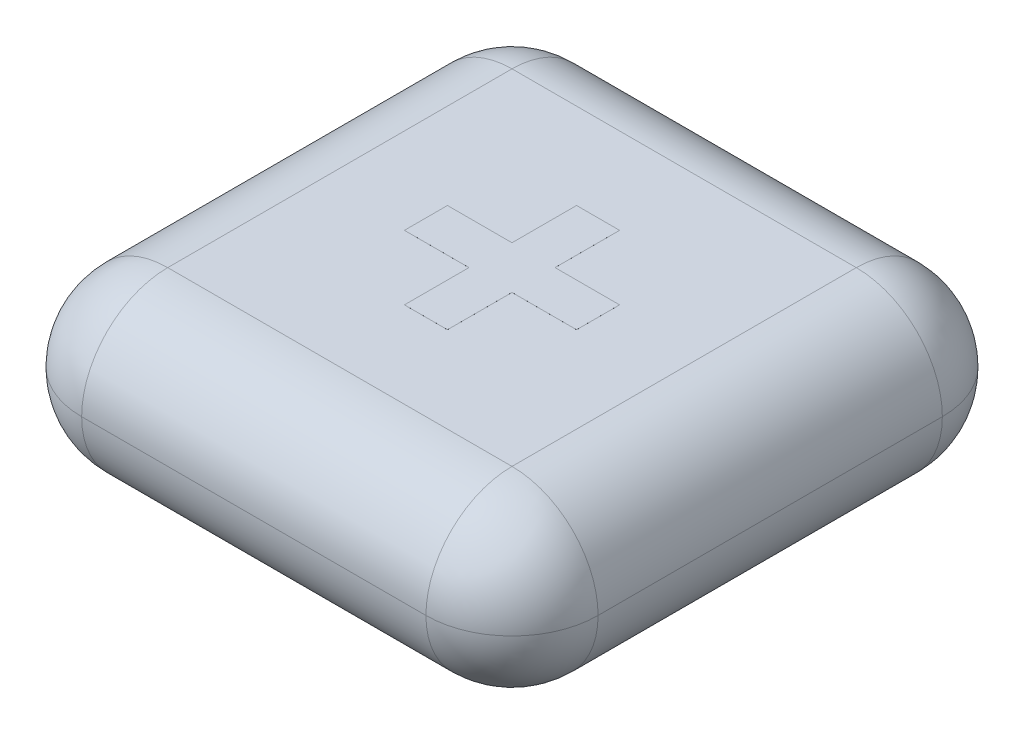
ISO-10303-21;
HEADER;
FILE_DESCRIPTION(('STEP AP214'),'2;1');
FILE_NAME('part.step','',(''),(''),'','','');
FILE_SCHEMA(('AUTOMOTIVE_DESIGN { 1 0 10303 214 1 1 1 1 }'));
ENDSEC;
DATA;
#1=APPLICATION_CONTEXT('core data for automotive mechanical design processes');
#2=APPLICATION_PROTOCOL_DEFINITION('international standard','automotive_design',2000,#1);
#3=PRODUCT_CONTEXT('',#1,'mechanical');
#4=PRODUCT('Part','Part','',(#3));
#5=PRODUCT_RELATED_PRODUCT_CATEGORY('part','',(#4));
#6=PRODUCT_DEFINITION_FORMATION('','',#4);
#7=PRODUCT_DEFINITION_CONTEXT('part definition',#1,'design');
#8=PRODUCT_DEFINITION('design','',#6,#7);
#9=PRODUCT_DEFINITION_SHAPE('','',#8);
#10=(LENGTH_UNIT() NAMED_UNIT(*) SI_UNIT(.MILLI.,.METRE.));
#11=(NAMED_UNIT(*) PLANE_ANGLE_UNIT() SI_UNIT($,.RADIAN.));
#12=(NAMED_UNIT(*) SI_UNIT($,.STERADIAN.) SOLID_ANGLE_UNIT());
#13=UNCERTAINTY_MEASURE_WITH_UNIT(LENGTH_MEASURE(1.E-05),#10,'distance_accuracy_value','');
#14=(GEOMETRIC_REPRESENTATION_CONTEXT(3) GLOBAL_UNCERTAINTY_ASSIGNED_CONTEXT((#13)) GLOBAL_UNIT_ASSIGNED_CONTEXT((#10,
#11,#12)) REPRESENTATION_CONTEXT('',''));
#15=CARTESIAN_POINT('',(0.,0.,0.));
#16=DIRECTION('',(0.,0.,1.));
#17=DIRECTION('',(1.,0.,0.));
#18=AXIS2_PLACEMENT_3D('',#15,#16,#17);
#19=CARTESIAN_POINT('',(0.,25.4,0.));
#20=DIRECTION('',(0.,1.,0.));
#21=DIRECTION('',(0.,0.,1.));
#22=AXIS2_PLACEMENT_3D('',#19,#20,#21);
#23=PLANE('',#22);
#24=DIRECTION('',(0.,0.,-1.));
#25=VECTOR('',#24,1.);
#26=CARTESIAN_POINT('',(-3.175,25.4,12.7));
#27=LINE('',#26,#25);
#28=CARTESIAN_POINT('',(-3.175,25.4,-3.175));
#29=VERTEX_POINT('',#28);
#30=CARTESIAN_POINT('',(-3.175,25.4,-12.7));
#31=VERTEX_POINT('',#30);
#32=EDGE_CURVE('E683',#29,#31,#27,.T.);
#33=ORIENTED_EDGE('',*,*,#32,.T.);
#34=DIRECTION('',(1.,0.,0.));
#35=VECTOR('',#34,1.);
#36=CARTESIAN_POINT('',(-3.175,25.4,-12.7));
#37=LINE('',#36,#35);
#38=CARTESIAN_POINT('',(3.175,25.4,-12.7));
#39=VERTEX_POINT('',#38);
#40=EDGE_CURVE('E679',#31,#39,#37,.T.);
#41=ORIENTED_EDGE('',*,*,#40,.T.);
#42=DIRECTION('',(0.,0.,-1.));
#43=VECTOR('',#42,1.);
#44=CARTESIAN_POINT('',(3.175,25.4,12.7));
#45=LINE('',#44,#43);
#46=CARTESIAN_POINT('',(3.175,25.4,-3.175));
#47=VERTEX_POINT('',#46);
#48=EDGE_CURVE('E676',#47,#39,#45,.T.);
#49=ORIENTED_EDGE('',*,*,#48,.F.);
#50=DIRECTION('',(1.,0.,0.));
#51=VECTOR('',#50,1.);
#52=CARTESIAN_POINT('',(0.,25.4,-3.175));
#53=LINE('',#52,#51);
#54=CARTESIAN_POINT('',(12.7,25.4,-3.175));
#55=VERTEX_POINT('',#54);
#56=EDGE_CURVE('E595',#47,#55,#53,.T.);
#57=ORIENTED_EDGE('',*,*,#56,.T.);
#58=DIRECTION('',(0.,0.,-1.));
#59=VECTOR('',#58,1.);
#60=CARTESIAN_POINT('',(12.7,25.4,0.));
#61=LINE('',#60,#59);
#62=CARTESIAN_POINT('',(12.7,25.4,3.175));
#63=VERTEX_POINT('',#62);
#64=EDGE_CURVE('E601',#63,#55,#61,.T.);
#65=ORIENTED_EDGE('',*,*,#64,.F.);
#66=DIRECTION('',(1.,0.,0.));
#67=VECTOR('',#66,1.);
#68=CARTESIAN_POINT('',(0.,25.4,3.175));
#69=LINE('',#68,#67);
#70=CARTESIAN_POINT('',(3.175,25.4,3.175));
#71=VERTEX_POINT('',#70);
#72=EDGE_CURVE('E607',#71,#63,#69,.T.);
#73=ORIENTED_EDGE('',*,*,#72,.F.);
#74=CARTESIAN_POINT('',(3.175,25.4,12.7));
#75=VERTEX_POINT('',#74);
#76=EDGE_CURVE('E570',#75,#71,#45,.T.);
#77=ORIENTED_EDGE('',*,*,#76,.F.);
#78=DIRECTION('',(1.,0.,0.));
#79=VECTOR('',#78,1.);
#80=CARTESIAN_POINT('',(-3.175,25.4,12.7));
#81=LINE('',#80,#79);
#82=CARTESIAN_POINT('',(-3.175,25.4,12.7));
#83=VERTEX_POINT('',#82);
#84=EDGE_CURVE('E95',#83,#75,#81,.T.);
#85=ORIENTED_EDGE('',*,*,#84,.F.);
#86=CARTESIAN_POINT('',(-3.175,25.4,3.175));
#87=VERTEX_POINT('',#86);
#88=EDGE_CURVE('E663',#83,#87,#27,.T.);
#89=ORIENTED_EDGE('',*,*,#88,.T.);
#90=DIRECTION('',(1.,0.,0.));
#91=VECTOR('',#90,1.);
#92=CARTESIAN_POINT('',(0.,25.4,3.175));
#93=LINE('',#92,#91);
#94=CARTESIAN_POINT('',(-12.7,25.4,3.175));
#95=VERTEX_POINT('',#94);
#96=EDGE_CURVE('E628',#95,#87,#93,.T.);
#97=ORIENTED_EDGE('',*,*,#96,.F.);
#98=DIRECTION('',(0.,0.,-1.));
#99=VECTOR('',#98,1.);
#100=CARTESIAN_POINT('',(-12.7,25.4,0.));
#101=LINE('',#100,#99);
#102=CARTESIAN_POINT('',(-12.7,25.4,-3.175));
#103=VERTEX_POINT('',#102);
#104=EDGE_CURVE('E641',#95,#103,#101,.T.);
#105=ORIENTED_EDGE('',*,*,#104,.T.);
#106=DIRECTION('',(1.,0.,0.));
#107=VECTOR('',#106,1.);
#108=CARTESIAN_POINT('',(0.,25.4,-3.175));
#109=LINE('',#108,#107);
#110=EDGE_CURVE('E637',#103,#29,#109,.T.);
#111=ORIENTED_EDGE('',*,*,#110,.T.);
#112=EDGE_LOOP('',(#33,#41,#49,#57,#65,#73,#77,#85,#89,#97,#105,#111));
#113=FACE_BOUND('',#112,.T.);
#114=DIRECTION('',(1.,0.,0.));
#115=VECTOR('',#114,1.);
#116=CARTESIAN_POINT('',(38.1,25.4,25.4));
#117=LINE('',#116,#115);
#118=CARTESIAN_POINT('',(-25.4,25.4,25.4));
#119=VERTEX_POINT('',#118);
#120=CARTESIAN_POINT('',(25.4,25.4,25.4));
#121=VERTEX_POINT('',#120);
#122=EDGE_CURVE('E87',#119,#121,#117,.T.);
#123=ORIENTED_EDGE('',*,*,#122,.T.);
#124=DIRECTION('',(0.,0.,-1.));
#125=VECTOR('',#124,1.);
#126=CARTESIAN_POINT('',(25.4,25.4,-38.1));
#127=LINE('',#126,#125);
#128=CARTESIAN_POINT('',(25.4,25.4,-25.4));
#129=VERTEX_POINT('',#128);
#130=EDGE_CURVE('E12',#121,#129,#127,.T.);
#131=ORIENTED_EDGE('',*,*,#130,.T.);
#132=DIRECTION('',(1.,0.,0.));
#133=VECTOR('',#132,1.);
#134=CARTESIAN_POINT('',(0.,25.4,-25.4));
#135=LINE('',#134,#133);
#136=CARTESIAN_POINT('',(-25.4,25.4,-25.4));
#137=VERTEX_POINT('',#136);
#138=EDGE_CURVE('E160',#129,#137,#135,.F.);
#139=ORIENTED_EDGE('',*,*,#138,.T.);
#140=DIRECTION('',(0.,0.,-1.));
#141=VECTOR('',#140,1.);
#142=CARTESIAN_POINT('',(-25.4,25.4,0.));
#143=LINE('',#142,#141);
#144=EDGE_CURVE('E162',#137,#119,#143,.F.);
#145=ORIENTED_EDGE('',*,*,#144,.T.);
#146=EDGE_LOOP('',(#123,#131,#139,#145));
#147=FACE_BOUND('',#146,.T.);
#148=ADVANCED_FACE('F77',(#113,#147),#23,.T.);
#149=CARTESIAN_POINT('',(0.,0.,0.));
#150=DIRECTION('',(0.,1.,0.));
#151=DIRECTION('',(0.,0.,1.));
#152=AXIS2_PLACEMENT_3D('',#149,#150,#151);
#153=PLANE('',#152);
#154=DIRECTION('',(1.,0.,0.));
#155=VECTOR('',#154,1.);
#156=CARTESIAN_POINT('',(0.,0.,25.4));
#157=LINE('',#156,#155);
#158=CARTESIAN_POINT('',(25.4,0.,25.4));
#159=VERTEX_POINT('',#158);
#160=CARTESIAN_POINT('',(-25.4,0.,25.4));
#161=VERTEX_POINT('',#160);
#162=EDGE_CURVE('E249',#159,#161,#157,.F.);
#163=ORIENTED_EDGE('',*,*,#162,.T.);
#164=DIRECTION('',(0.,0.,-1.));
#165=VECTOR('',#164,1.);
#166=CARTESIAN_POINT('',(-25.4,0.,-38.1));
#167=LINE('',#166,#165);
#168=CARTESIAN_POINT('',(-25.4,0.,-25.4));
#169=VERTEX_POINT('',#168);
#170=EDGE_CURVE('E169',#161,#169,#167,.T.);
#171=ORIENTED_EDGE('',*,*,#170,.T.);
#172=DIRECTION('',(1.,0.,0.));
#173=VECTOR('',#172,1.);
#174=CARTESIAN_POINT('',(38.1,0.,-25.4));
#175=LINE('',#174,#173);
#176=CARTESIAN_POINT('',(25.4,0.,-25.4));
#177=VERTEX_POINT('',#176);
#178=EDGE_CURVE('E143',#169,#177,#175,.T.);
#179=ORIENTED_EDGE('',*,*,#178,.T.);
#180=DIRECTION('',(0.,0.,-1.));
#181=VECTOR('',#180,1.);
#182=CARTESIAN_POINT('',(25.4,0.,0.));
#183=LINE('',#182,#181);
#184=EDGE_CURVE('E243',#177,#159,#183,.F.);
#185=ORIENTED_EDGE('',*,*,#184,.T.);
#186=EDGE_LOOP('',(#163,#171,#179,#185));
#187=FACE_BOUND('',#186,.T.);
#188=ADVANCED_FACE('F296',(#187),#153,.F.);
#189=CARTESIAN_POINT('',(-25.4,12.7,25.4));
#190=DIRECTION('',(0.,0.,1.));
#191=DIRECTION('',(1.,0.,0.));
#192=AXIS2_PLACEMENT_3D('',#189,#190,#191);
#193=SPHERICAL_SURFACE('',#192,12.7);
#194=CARTESIAN_POINT('',(-25.4,12.7,25.4));
#195=DIRECTION('',(0.,0.,1.));
#196=DIRECTION('',(1.,0.,0.));
#197=AXIS2_PLACEMENT_3D('',#194,#195,#196);
#198=CIRCLE('',#197,12.7);
#199=CARTESIAN_POINT('',(-38.1,12.7,25.4));
#200=VERTEX_POINT('',#199);
#201=EDGE_CURVE('E178',#200,#119,#198,.F.);
#202=ORIENTED_EDGE('',*,*,#201,.F.);
#203=CARTESIAN_POINT('',(-25.4,12.7,25.4));
#204=DIRECTION('',(0.,-1.,0.));
#205=DIRECTION('',(0.,0.,-1.));
#206=AXIS2_PLACEMENT_3D('',#203,#204,#205);
#207=CIRCLE('',#206,12.7);
#208=CARTESIAN_POINT('',(-25.4,12.7,38.1));
#209=VERTEX_POINT('',#208);
#210=EDGE_CURVE('E81',#209,#200,#207,.T.);
#211=ORIENTED_EDGE('',*,*,#210,.F.);
#212=CARTESIAN_POINT('',(-25.4,12.7,25.4));
#213=DIRECTION('',(-1.,0.,0.));
#214=DIRECTION('',(0.,0.,1.));
#215=AXIS2_PLACEMENT_3D('',#212,#213,#214);
#216=CIRCLE('',#215,12.7);
#217=EDGE_CURVE('E237',#119,#209,#216,.F.);
#218=ORIENTED_EDGE('',*,*,#217,.F.);
#219=EDGE_LOOP('',(#202,#211,#218));
#220=FACE_BOUND('',#219,.T.);
#221=ADVANCED_FACE('F79',(#220),#193,.T.);
#222=CARTESIAN_POINT('',(-25.4,12.7,25.4));
#223=DIRECTION('',(-1.,0.,0.));
#224=DIRECTION('',(0.,0.,1.));
#225=AXIS2_PLACEMENT_3D('',#222,#223,#224);
#226=SPHERICAL_SURFACE('',#225,12.7);
#227=CARTESIAN_POINT('',(-25.4,12.7,25.4));
#228=DIRECTION('',(-1.,0.,0.));
#229=DIRECTION('',(0.,0.,1.));
#230=AXIS2_PLACEMENT_3D('',#227,#228,#229);
#231=CIRCLE('',#230,12.7);
#232=EDGE_CURVE('E225',#209,#161,#231,.F.);
#233=ORIENTED_EDGE('',*,*,#232,.F.);
#234=ORIENTED_EDGE('',*,*,#210,.T.);
#235=CARTESIAN_POINT('',(-25.4,12.7,25.4));
#236=DIRECTION('',(0.,0.,1.));
#237=DIRECTION('',(1.,0.,0.));
#238=AXIS2_PLACEMENT_3D('',#235,#236,#237);
#239=CIRCLE('',#238,12.7);
#240=EDGE_CURVE('E229',#161,#200,#239,.F.);
#241=ORIENTED_EDGE('',*,*,#240,.F.);
#242=EDGE_LOOP('',(#233,#234,#241));
#243=FACE_BOUND('',#242,.T.);
#244=ADVANCED_FACE('F301',(#243),#226,.T.);
#245=CARTESIAN_POINT('',(0.,12.7,25.4));
#246=DIRECTION('',(-1.,0.,0.));
#247=DIRECTION('',(0.,0.,1.));
#248=AXIS2_PLACEMENT_3D('',#245,#246,#247);
#249=CYLINDRICAL_SURFACE('',#248,12.7);
#250=ORIENTED_EDGE('',*,*,#122,.F.);
#251=ORIENTED_EDGE('',*,*,#217,.T.);
#252=DIRECTION('',(1.,0.,0.));
#253=VECTOR('',#252,1.);
#254=CARTESIAN_POINT('',(-38.1,12.7,38.1));
#255=LINE('',#254,#253);
#256=CARTESIAN_POINT('',(25.4,12.7,38.1));
#257=VERTEX_POINT('',#256);
#258=EDGE_CURVE('E221',#257,#209,#255,.F.);
#259=ORIENTED_EDGE('',*,*,#258,.F.);
#260=CARTESIAN_POINT('',(25.4,12.7,25.4));
#261=DIRECTION('',(1.,0.,0.));
#262=DIRECTION('',(0.,0.,-1.));
#263=AXIS2_PLACEMENT_3D('',#260,#261,#262);
#264=CIRCLE('',#263,12.7);
#265=EDGE_CURVE('E189',#121,#257,#264,.T.);
#266=ORIENTED_EDGE('',*,*,#265,.F.);
#267=EDGE_LOOP('',(#250,#251,#259,#266));
#268=FACE_BOUND('',#267,.T.);
#269=ADVANCED_FACE('F303',(#268),#249,.T.);
#270=CARTESIAN_POINT('',(-25.4,12.7,38.1));
#271=DIRECTION('',(0.,0.,-1.));
#272=DIRECTION('',(-1.,0.,0.));
#273=AXIS2_PLACEMENT_3D('',#270,#271,#272);
#274=CYLINDRICAL_SURFACE('',#273,12.7);
#275=CARTESIAN_POINT('',(-25.4,12.7,-25.4));
#276=DIRECTION('',(0.,0.,-1.));
#277=DIRECTION('',(-1.,0.,0.));
#278=AXIS2_PLACEMENT_3D('',#275,#276,#277);
#279=CIRCLE('',#278,12.7);
#280=CARTESIAN_POINT('',(-38.1,12.7,-25.4));
#281=VERTEX_POINT('',#280);
#282=EDGE_CURVE('E176',#281,#137,#279,.T.);
#283=ORIENTED_EDGE('',*,*,#282,.F.);
#284=DIRECTION('',(0.,0.,-1.));
#285=VECTOR('',#284,1.);
#286=CARTESIAN_POINT('',(-38.1,12.7,38.1));
#287=LINE('',#286,#285);
#288=EDGE_CURVE('E233',#200,#281,#287,.T.);
#289=ORIENTED_EDGE('',*,*,#288,.F.);
#290=ORIENTED_EDGE('',*,*,#201,.T.);
#291=ORIENTED_EDGE('',*,*,#144,.F.);
#292=EDGE_LOOP('',(#283,#289,#290,#291));
#293=FACE_BOUND('',#292,.T.);
#294=ADVANCED_FACE('F174',(#293),#274,.T.);
#295=CARTESIAN_POINT('',(-25.4,12.7,0.));
#296=DIRECTION('',(0.,0.,1.));
#297=DIRECTION('',(1.,0.,0.));
#298=AXIS2_PLACEMENT_3D('',#295,#296,#297);
#299=CYLINDRICAL_SURFACE('',#298,12.7);
#300=ORIENTED_EDGE('',*,*,#240,.T.);
#301=ORIENTED_EDGE('',*,*,#288,.T.);
#302=CARTESIAN_POINT('',(-25.4,12.7,-25.4));
#303=DIRECTION('',(0.,0.,-1.));
#304=DIRECTION('',(-1.,0.,0.));
#305=AXIS2_PLACEMENT_3D('',#302,#303,#304);
#306=CIRCLE('',#305,12.7);
#307=EDGE_CURVE('E212',#169,#281,#306,.T.);
#308=ORIENTED_EDGE('',*,*,#307,.F.);
#309=ORIENTED_EDGE('',*,*,#170,.F.);
#310=EDGE_LOOP('',(#300,#301,#308,#309));
#311=FACE_BOUND('',#310,.T.);
#312=ADVANCED_FACE('F295',(#311),#299,.T.);
#313=CARTESIAN_POINT('',(-38.1,12.7,25.4));
#314=DIRECTION('',(1.,0.,0.));
#315=DIRECTION('',(0.,0.,-1.));
#316=AXIS2_PLACEMENT_3D('',#313,#314,#315);
#317=CYLINDRICAL_SURFACE('',#316,12.7);
#318=CARTESIAN_POINT('',(25.4,12.7,25.4));
#319=DIRECTION('',(1.,0.,0.));
#320=DIRECTION('',(0.,0.,-1.));
#321=AXIS2_PLACEMENT_3D('',#318,#319,#320);
#322=CIRCLE('',#321,12.7);
#323=EDGE_CURVE('E208',#257,#159,#322,.T.);
#324=ORIENTED_EDGE('',*,*,#323,.F.);
#325=ORIENTED_EDGE('',*,*,#258,.T.);
#326=ORIENTED_EDGE('',*,*,#232,.T.);
#327=ORIENTED_EDGE('',*,*,#162,.F.);
#328=EDGE_LOOP('',(#324,#325,#326,#327));
#329=FACE_BOUND('',#328,.T.);
#330=ADVANCED_FACE('F300',(#329),#317,.T.);
#331=CARTESIAN_POINT('',(25.4,12.7,25.4));
#332=DIRECTION('',(0.,0.,1.));
#333=DIRECTION('',(1.,0.,0.));
#334=AXIS2_PLACEMENT_3D('',#331,#332,#333);
#335=SPHERICAL_SURFACE('',#334,12.7);
#336=ORIENTED_EDGE('',*,*,#265,.T.);
#337=CARTESIAN_POINT('',(25.4,12.7,25.4));
#338=DIRECTION('',(0.,-1.,0.));
#339=DIRECTION('',(0.,0.,-1.));
#340=AXIS2_PLACEMENT_3D('',#337,#338,#339);
#341=CIRCLE('',#340,12.7);
#342=CARTESIAN_POINT('',(38.1,12.7,25.4));
#343=VERTEX_POINT('',#342);
#344=EDGE_CURVE('E199',#343,#257,#341,.T.);
#345=ORIENTED_EDGE('',*,*,#344,.F.);
#346=CARTESIAN_POINT('',(25.4,12.7,25.4));
#347=DIRECTION('',(0.,0.,1.));
#348=DIRECTION('',(1.,0.,0.));
#349=AXIS2_PLACEMENT_3D('',#346,#347,#348);
#350=CIRCLE('',#349,12.7);
#351=EDGE_CURVE('E194',#121,#343,#350,.F.);
#352=ORIENTED_EDGE('',*,*,#351,.F.);
#353=EDGE_LOOP('',(#336,#345,#352));
#354=FACE_BOUND('',#353,.T.);
#355=ADVANCED_FACE('F353',(#354),#335,.T.);
#356=CARTESIAN_POINT('',(-25.4,12.7,-25.4));
#357=DIRECTION('',(-1.,0.,0.));
#358=DIRECTION('',(0.,0.,1.));
#359=AXIS2_PLACEMENT_3D('',#356,#357,#358);
#360=SPHERICAL_SURFACE('',#359,12.7);
#361=CARTESIAN_POINT('',(-25.4,12.7,-25.4));
#362=DIRECTION('',(0.,1.,0.));
#363=DIRECTION('',(0.,0.,1.));
#364=AXIS2_PLACEMENT_3D('',#361,#362,#363);
#365=CIRCLE('',#364,12.7);
#366=CARTESIAN_POINT('',(-25.4,12.7,-38.1));
#367=VERTEX_POINT('',#366);
#368=EDGE_CURVE('E187',#367,#281,#365,.T.);
#369=ORIENTED_EDGE('',*,*,#368,.T.);
#370=ORIENTED_EDGE('',*,*,#282,.T.);
#371=CARTESIAN_POINT('',(-25.4,12.7,-25.4));
#372=DIRECTION('',(-1.,0.,0.));
#373=DIRECTION('',(0.,0.,1.));
#374=AXIS2_PLACEMENT_3D('',#371,#372,#373);
#375=CIRCLE('',#374,12.7);
#376=EDGE_CURVE('E185',#367,#137,#375,.F.);
#377=ORIENTED_EDGE('',*,*,#376,.F.);
#378=EDGE_LOOP('',(#369,#370,#377));
#379=FACE_BOUND('',#378,.T.);
#380=ADVANCED_FACE('F184',(#379),#360,.T.);
#381=CARTESIAN_POINT('',(-25.4,12.7,-25.4));
#382=DIRECTION('',(-1.,0.,0.));
#383=DIRECTION('',(0.,0.,1.));
#384=AXIS2_PLACEMENT_3D('',#381,#382,#383);
#385=SPHERICAL_SURFACE('',#384,12.7);
#386=ORIENTED_EDGE('',*,*,#307,.T.);
#387=ORIENTED_EDGE('',*,*,#368,.F.);
#388=CARTESIAN_POINT('',(-25.4,12.7,-25.4));
#389=DIRECTION('',(-1.,0.,0.));
#390=DIRECTION('',(0.,0.,1.));
#391=AXIS2_PLACEMENT_3D('',#388,#389,#390);
#392=CIRCLE('',#391,12.7);
#393=EDGE_CURVE('E201',#169,#367,#392,.F.);
#394=ORIENTED_EDGE('',*,*,#393,.F.);
#395=EDGE_LOOP('',(#386,#387,#394));
#396=FACE_BOUND('',#395,.T.);
#397=ADVANCED_FACE('F292',(#396),#385,.T.);
#398=CARTESIAN_POINT('',(25.4,12.7,25.4));
#399=DIRECTION('',(0.,0.,1.));
#400=DIRECTION('',(1.,0.,0.));
#401=AXIS2_PLACEMENT_3D('',#398,#399,#400);
#402=SPHERICAL_SURFACE('',#401,12.7);
#403=ORIENTED_EDGE('',*,*,#344,.T.);
#404=ORIENTED_EDGE('',*,*,#323,.T.);
#405=CARTESIAN_POINT('',(25.4,12.7,25.4));
#406=DIRECTION('',(0.,0.,1.));
#407=DIRECTION('',(1.,0.,0.));
#408=AXIS2_PLACEMENT_3D('',#405,#406,#407);
#409=CIRCLE('',#408,12.7);
#410=EDGE_CURVE('E285',#343,#159,#409,.F.);
#411=ORIENTED_EDGE('',*,*,#410,.F.);
#412=EDGE_LOOP('',(#403,#404,#411));
#413=FACE_BOUND('',#412,.T.);
#414=ADVANCED_FACE('F344',(#413),#402,.T.);
#415=CARTESIAN_POINT('',(25.4,12.7,0.));
#416=DIRECTION('',(0.,0.,1.));
#417=DIRECTION('',(1.,0.,0.));
#418=AXIS2_PLACEMENT_3D('',#415,#416,#417);
#419=CYLINDRICAL_SURFACE('',#418,12.7);
#420=ORIENTED_EDGE('',*,*,#130,.F.);
#421=ORIENTED_EDGE('',*,*,#351,.T.);
#422=DIRECTION('',(0.,0.,-1.));
#423=VECTOR('',#422,1.);
#424=CARTESIAN_POINT('',(38.1,12.7,38.1));
#425=LINE('',#424,#423);
#426=CARTESIAN_POINT('',(38.1,12.7,-25.4));
#427=VERTEX_POINT('',#426);
#428=EDGE_CURVE('E281',#427,#343,#425,.F.);
#429=ORIENTED_EDGE('',*,*,#428,.F.);
#430=CARTESIAN_POINT('',(25.4,12.7,-25.4));
#431=DIRECTION('',(0.,0.,-1.));
#432=DIRECTION('',(-1.,0.,0.));
#433=AXIS2_PLACEMENT_3D('',#430,#431,#432);
#434=CIRCLE('',#433,12.7);
#435=EDGE_CURVE('E277',#129,#427,#434,.T.);
#436=ORIENTED_EDGE('',*,*,#435,.F.);
#437=EDGE_LOOP('',(#420,#421,#429,#436));
#438=FACE_BOUND('',#437,.T.);
#439=ADVANCED_FACE('F341',(#438),#419,.T.);
#440=CARTESIAN_POINT('',(-38.1,12.7,-25.4));
#441=DIRECTION('',(1.,0.,0.));
#442=DIRECTION('',(0.,0.,-1.));
#443=AXIS2_PLACEMENT_3D('',#440,#441,#442);
#444=CYLINDRICAL_SURFACE('',#443,12.7);
#445=DIRECTION('',(1.,0.,0.));
#446=VECTOR('',#445,1.);
#447=CARTESIAN_POINT('',(-38.1,12.7,-38.1));
#448=LINE('',#447,#446);
#449=CARTESIAN_POINT('',(25.4,12.7,-38.1));
#450=VERTEX_POINT('',#449);
#451=EDGE_CURVE('E192',#367,#450,#448,.T.);
#452=ORIENTED_EDGE('',*,*,#451,.F.);
#453=ORIENTED_EDGE('',*,*,#376,.T.);
#454=ORIENTED_EDGE('',*,*,#138,.F.);
#455=CARTESIAN_POINT('',(25.4,12.7,-25.4));
#456=DIRECTION('',(1.,0.,0.));
#457=DIRECTION('',(0.,0.,-1.));
#458=AXIS2_PLACEMENT_3D('',#455,#456,#457);
#459=CIRCLE('',#458,12.7);
#460=EDGE_CURVE('E274',#450,#129,#459,.T.);
#461=ORIENTED_EDGE('',*,*,#460,.F.);
#462=EDGE_LOOP('',(#452,#453,#454,#461));
#463=FACE_BOUND('',#462,.T.);
#464=ADVANCED_FACE('F191',(#463),#444,.T.);
#465=CARTESIAN_POINT('',(0.,12.7,-25.4));
#466=DIRECTION('',(-1.,0.,0.));
#467=DIRECTION('',(0.,0.,1.));
#468=AXIS2_PLACEMENT_3D('',#465,#466,#467);
#469=CYLINDRICAL_SURFACE('',#468,12.7);
#470=ORIENTED_EDGE('',*,*,#393,.T.);
#471=ORIENTED_EDGE('',*,*,#451,.T.);
#472=CARTESIAN_POINT('',(25.4,12.7,-25.4));
#473=DIRECTION('',(1.,0.,0.));
#474=DIRECTION('',(0.,0.,-1.));
#475=AXIS2_PLACEMENT_3D('',#472,#473,#474);
#476=CIRCLE('',#475,12.7);
#477=EDGE_CURVE('E270',#177,#450,#476,.T.);
#478=ORIENTED_EDGE('',*,*,#477,.F.);
#479=ORIENTED_EDGE('',*,*,#178,.F.);
#480=EDGE_LOOP('',(#470,#471,#478,#479));
#481=FACE_BOUND('',#480,.T.);
#482=ADVANCED_FACE('F289',(#481),#469,.T.);
#483=CARTESIAN_POINT('',(25.4,12.7,38.1));
#484=DIRECTION('',(0.,0.,-1.));
#485=DIRECTION('',(-1.,0.,0.));
#486=AXIS2_PLACEMENT_3D('',#483,#484,#485);
#487=CYLINDRICAL_SURFACE('',#486,12.7);
#488=ORIENTED_EDGE('',*,*,#410,.T.);
#489=ORIENTED_EDGE('',*,*,#184,.F.);
#490=CARTESIAN_POINT('',(25.4,12.7,-25.4));
#491=DIRECTION('',(0.,0.,-1.));
#492=DIRECTION('',(-1.,0.,0.));
#493=AXIS2_PLACEMENT_3D('',#490,#491,#492);
#494=CIRCLE('',#493,12.7);
#495=EDGE_CURVE('E265',#427,#177,#494,.T.);
#496=ORIENTED_EDGE('',*,*,#495,.F.);
#497=ORIENTED_EDGE('',*,*,#428,.T.);
#498=EDGE_LOOP('',(#488,#489,#496,#497));
#499=FACE_BOUND('',#498,.T.);
#500=ADVANCED_FACE('F332',(#499),#487,.T.);
#501=CARTESIAN_POINT('',(25.4,12.7,-25.4));
#502=DIRECTION('',(0.,1.,0.));
#503=DIRECTION('',(0.,0.,1.));
#504=AXIS2_PLACEMENT_3D('',#501,#502,#503);
#505=SPHERICAL_SURFACE('',#504,12.7);
#506=ORIENTED_EDGE('',*,*,#460,.T.);
#507=ORIENTED_EDGE('',*,*,#435,.T.);
#508=CARTESIAN_POINT('',(25.4,12.7,-25.4));
#509=DIRECTION('',(0.,1.,0.));
#510=DIRECTION('',(0.,0.,1.));
#511=AXIS2_PLACEMENT_3D('',#508,#509,#510);
#512=CIRCLE('',#511,12.7);
#513=EDGE_CURVE('E261',#450,#427,#512,.F.);
#514=ORIENTED_EDGE('',*,*,#513,.F.);
#515=EDGE_LOOP('',(#506,#507,#514));
#516=FACE_BOUND('',#515,.T.);
#517=ADVANCED_FACE('F327',(#516),#505,.T.);
#518=CARTESIAN_POINT('',(25.4,12.7,-25.4));
#519=DIRECTION('',(0.,-1.,0.));
#520=DIRECTION('',(0.,0.,-1.));
#521=AXIS2_PLACEMENT_3D('',#518,#519,#520);
#522=SPHERICAL_SURFACE('',#521,12.7);
#523=ORIENTED_EDGE('',*,*,#495,.T.);
#524=ORIENTED_EDGE('',*,*,#477,.T.);
#525=ORIENTED_EDGE('',*,*,#513,.T.);
#526=EDGE_LOOP('',(#523,#524,#525));
#527=FACE_BOUND('',#526,.T.);
#528=ADVANCED_FACE('F324',(#527),#522,.T.);
#529=CARTESIAN_POINT('',(0.,25.40254,3.175));
#530=DIRECTION('',(0.,0.,-1.));
#531=DIRECTION('',(-1.,0.,0.));
#532=AXIS2_PLACEMENT_3D('',#529,#530,#531);
#533=PLANE('',#532);
#534=ORIENTED_EDGE('',*,*,#72,.T.);
#535=DIRECTION('',(0.,-1.,0.));
#536=VECTOR('',#535,1.);
#537=CARTESIAN_POINT('',(12.7,25.40254,3.175));
#538=LINE('',#537,#536);
#539=CARTESIAN_POINT('',(12.7,25.40254,3.175));
#540=VERTEX_POINT('',#539);
#541=EDGE_CURVE('E266',#540,#63,#538,.T.);
#542=ORIENTED_EDGE('',*,*,#541,.F.);
#543=DIRECTION('',(1.,0.,0.));
#544=VECTOR('',#543,1.);
#545=CARTESIAN_POINT('',(0.,25.40254,3.175));
#546=LINE('',#545,#544);
#547=CARTESIAN_POINT('',(3.175,25.40254,3.175));
#548=VERTEX_POINT('',#547);
#549=EDGE_CURVE('E583',#548,#540,#546,.T.);
#550=ORIENTED_EDGE('',*,*,#549,.F.);
#551=DIRECTION('',(0.,-1.,0.));
#552=VECTOR('',#551,1.);
#553=CARTESIAN_POINT('',(3.175,25.40254,3.175));
#554=LINE('',#553,#552);
#555=EDGE_CURVE('E563',#548,#71,#554,.T.);
#556=ORIENTED_EDGE('',*,*,#555,.T.);
#557=EDGE_LOOP('',(#534,#542,#550,#556));
#558=FACE_BOUND('',#557,.T.);
#559=ADVANCED_FACE('F326',(#558),#533,.F.);
#560=CARTESIAN_POINT('',(12.7,25.40254,0.));
#561=DIRECTION('',(-1.,0.,0.));
#562=DIRECTION('',(0.,0.,1.));
#563=AXIS2_PLACEMENT_3D('',#560,#561,#562);
#564=PLANE('',#563);
#565=ORIENTED_EDGE('',*,*,#64,.T.);
#566=DIRECTION('',(0.,-1.,0.));
#567=VECTOR('',#566,1.);
#568=CARTESIAN_POINT('',(12.7,25.40254,-3.175));
#569=LINE('',#568,#567);
#570=CARTESIAN_POINT('',(12.7,25.40254,-3.175));
#571=VERTEX_POINT('',#570);
#572=EDGE_CURVE('E617',#571,#55,#569,.T.);
#573=ORIENTED_EDGE('',*,*,#572,.F.);
#574=DIRECTION('',(0.,0.,-1.));
#575=VECTOR('',#574,1.);
#576=CARTESIAN_POINT('',(12.7,25.40254,0.));
#577=LINE('',#576,#575);
#578=EDGE_CURVE('E594',#540,#571,#577,.T.);
#579=ORIENTED_EDGE('',*,*,#578,.F.);
#580=ORIENTED_EDGE('',*,*,#541,.T.);
#581=EDGE_LOOP('',(#565,#573,#579,#580));
#582=FACE_BOUND('',#581,.T.);
#583=ADVANCED_FACE('F435',(#582),#564,.F.);
#584=CARTESIAN_POINT('',(0.,25.40254,-3.175));
#585=DIRECTION('',(0.,0.,-1.));
#586=DIRECTION('',(-1.,0.,0.));
#587=AXIS2_PLACEMENT_3D('',#584,#585,#586);
#588=PLANE('',#587);
#589=ORIENTED_EDGE('',*,*,#56,.F.);
#590=DIRECTION('',(0.,-1.,0.));
#591=VECTOR('',#590,1.);
#592=CARTESIAN_POINT('',(3.175,25.40254,-3.175));
#593=LINE('',#592,#591);
#594=CARTESIAN_POINT('',(3.175,25.40254,-3.175));
#595=VERTEX_POINT('',#594);
#596=EDGE_CURVE('E577',#595,#47,#593,.T.);
#597=ORIENTED_EDGE('',*,*,#596,.F.);
#598=DIRECTION('',(1.,0.,0.));
#599=VECTOR('',#598,1.);
#600=CARTESIAN_POINT('',(0.,25.40254,-3.175));
#601=LINE('',#600,#599);
#602=EDGE_CURVE('E578',#595,#571,#601,.T.);
#603=ORIENTED_EDGE('',*,*,#602,.T.);
#604=ORIENTED_EDGE('',*,*,#572,.T.);
#605=EDGE_LOOP('',(#589,#597,#603,#604));
#606=FACE_BOUND('',#605,.T.);
#607=ADVANCED_FACE('F446',(#606),#588,.T.);
#608=CARTESIAN_POINT('',(0.,25.40254,0.));
#609=DIRECTION('',(0.,1.,0.));
#610=DIRECTION('',(0.,0.,1.));
#611=AXIS2_PLACEMENT_3D('',#608,#609,#610);
#612=PLANE('',#611);
#613=ORIENTED_EDGE('',*,*,#549,.T.);
#614=ORIENTED_EDGE('',*,*,#578,.T.);
#615=ORIENTED_EDGE('',*,*,#602,.F.);
#616=DIRECTION('',(0.,0.,-1.));
#617=VECTOR('',#616,1.);
#618=CARTESIAN_POINT('',(3.175,25.40254,12.7));
#619=LINE('',#618,#617);
#620=CARTESIAN_POINT('',(3.175,25.40254,-12.7));
#621=VERTEX_POINT('',#620);
#622=EDGE_CURVE('E590',#595,#621,#619,.T.);
#623=ORIENTED_EDGE('',*,*,#622,.T.);
#624=DIRECTION('',(1.,0.,0.));
#625=VECTOR('',#624,1.);
#626=CARTESIAN_POINT('',(-3.175,25.40254,-12.7));
#627=LINE('',#626,#625);
#628=CARTESIAN_POINT('',(-3.175,25.40254,-12.7));
#629=VERTEX_POINT('',#628);
#630=EDGE_CURVE('E589',#629,#621,#627,.T.);
#631=ORIENTED_EDGE('',*,*,#630,.F.);
#632=DIRECTION('',(0.,0.,-1.));
#633=VECTOR('',#632,1.);
#634=CARTESIAN_POINT('',(-3.175,25.40254,12.7));
#635=LINE('',#634,#633);
#636=CARTESIAN_POINT('',(-3.175,25.40254,-3.175));
#637=VERTEX_POINT('',#636);
#638=EDGE_CURVE('E668',#637,#629,#635,.T.);
#639=ORIENTED_EDGE('',*,*,#638,.F.);
#640=DIRECTION('',(1.,0.,0.));
#641=VECTOR('',#640,1.);
#642=CARTESIAN_POINT('',(0.,25.40254,-3.175));
#643=LINE('',#642,#641);
#644=CARTESIAN_POINT('',(-12.7,25.40254,-3.175));
#645=VERTEX_POINT('',#644);
#646=EDGE_CURVE('E623',#645,#637,#643,.T.);
#647=ORIENTED_EDGE('',*,*,#646,.F.);
#648=DIRECTION('',(0.,0.,-1.));
#649=VECTOR('',#648,1.);
#650=CARTESIAN_POINT('',(-12.7,25.40254,0.));
#651=LINE('',#650,#649);
#652=CARTESIAN_POINT('',(-12.7,25.40254,3.175));
#653=VERTEX_POINT('',#652);
#654=EDGE_CURVE('E627',#653,#645,#651,.T.);
#655=ORIENTED_EDGE('',*,*,#654,.F.);
#656=DIRECTION('',(1.,0.,0.));
#657=VECTOR('',#656,1.);
#658=CARTESIAN_POINT('',(0.,25.40254,3.175));
#659=LINE('',#658,#657);
#660=CARTESIAN_POINT('',(-3.175,25.40254,3.175));
#661=VERTEX_POINT('',#660);
#662=EDGE_CURVE('E632',#653,#661,#659,.T.);
#663=ORIENTED_EDGE('',*,*,#662,.T.);
#664=CARTESIAN_POINT('',(-3.175,25.40254,12.7));
#665=VERTEX_POINT('',#664);
#666=EDGE_CURVE('E669',#665,#661,#635,.T.);
#667=ORIENTED_EDGE('',*,*,#666,.F.);
#668=DIRECTION('',(1.,0.,0.));
#669=VECTOR('',#668,1.);
#670=CARTESIAN_POINT('',(-3.175,25.40254,12.7));
#671=LINE('',#670,#669);
#672=CARTESIAN_POINT('',(3.175,25.40254,12.7));
#673=VERTEX_POINT('',#672);
#674=EDGE_CURVE('E587',#665,#673,#671,.T.);
#675=ORIENTED_EDGE('',*,*,#674,.T.);
#676=EDGE_CURVE('E566',#673,#548,#619,.T.);
#677=ORIENTED_EDGE('',*,*,#676,.T.);
#678=EDGE_LOOP('',(#613,#614,#615,#623,#631,#639,#647,#655,#663,#667,#675,#677));
#679=FACE_BOUND('',#678,.T.);
#680=ADVANCED_FACE('F456',(#679),#612,.T.);
#681=CARTESIAN_POINT('',(0.,25.40254,3.175));
#682=DIRECTION('',(0.,0.,-1.));
#683=DIRECTION('',(-1.,0.,0.));
#684=AXIS2_PLACEMENT_3D('',#681,#682,#683);
#685=PLANE('',#684);
#686=ORIENTED_EDGE('',*,*,#96,.T.);
#687=DIRECTION('',(0.,-1.,0.));
#688=VECTOR('',#687,1.);
#689=CARTESIAN_POINT('',(-3.175,25.40254,3.175));
#690=LINE('',#689,#688);
#691=EDGE_CURVE('E651',#661,#87,#690,.T.);
#692=ORIENTED_EDGE('',*,*,#691,.F.);
#693=ORIENTED_EDGE('',*,*,#662,.F.);
#694=DIRECTION('',(0.,-1.,0.));
#695=VECTOR('',#694,1.);
#696=CARTESIAN_POINT('',(-12.7,25.40254,3.175));
#697=LINE('',#696,#695);
#698=EDGE_CURVE('E655',#653,#95,#697,.T.);
#699=ORIENTED_EDGE('',*,*,#698,.T.);
#700=EDGE_LOOP('',(#686,#692,#693,#699));
#701=FACE_BOUND('',#700,.T.);
#702=ADVANCED_FACE('F438',(#701),#685,.F.);
#703=CARTESIAN_POINT('',(-12.7,25.40254,0.));
#704=DIRECTION('',(-1.,0.,0.));
#705=DIRECTION('',(0.,0.,1.));
#706=AXIS2_PLACEMENT_3D('',#703,#704,#705);
#707=PLANE('',#706);
#708=ORIENTED_EDGE('',*,*,#104,.F.);
#709=ORIENTED_EDGE('',*,*,#698,.F.);
#710=ORIENTED_EDGE('',*,*,#654,.T.);
#711=DIRECTION('',(0.,-1.,0.));
#712=VECTOR('',#711,1.);
#713=CARTESIAN_POINT('',(-12.7,25.40254,-3.175));
#714=LINE('',#713,#712);
#715=EDGE_CURVE('E610',#645,#103,#714,.T.);
#716=ORIENTED_EDGE('',*,*,#715,.T.);
#717=EDGE_LOOP('',(#708,#709,#710,#716));
#718=FACE_BOUND('',#717,.T.);
#719=ADVANCED_FACE('F483',(#718),#707,.T.);
#720=CARTESIAN_POINT('',(0.,25.40254,-3.175));
#721=DIRECTION('',(0.,0.,-1.));
#722=DIRECTION('',(-1.,0.,0.));
#723=AXIS2_PLACEMENT_3D('',#720,#721,#722);
#724=PLANE('',#723);
#725=ORIENTED_EDGE('',*,*,#110,.F.);
#726=ORIENTED_EDGE('',*,*,#715,.F.);
#727=ORIENTED_EDGE('',*,*,#646,.T.);
#728=DIRECTION('',(0.,-1.,0.));
#729=VECTOR('',#728,1.);
#730=CARTESIAN_POINT('',(-3.175,25.40254,-3.175));
#731=LINE('',#730,#729);
#732=EDGE_CURVE('E636',#637,#29,#731,.T.);
#733=ORIENTED_EDGE('',*,*,#732,.T.);
#734=EDGE_LOOP('',(#725,#726,#727,#733));
#735=FACE_BOUND('',#734,.T.);
#736=ADVANCED_FACE('F493',(#735),#724,.T.);
#737=CARTESIAN_POINT('',(-3.175,25.40254,12.7));
#738=DIRECTION('',(-1.,0.,0.));
#739=DIRECTION('',(0.,0.,1.));
#740=AXIS2_PLACEMENT_3D('',#737,#738,#739);
#741=PLANE('',#740);
#742=ORIENTED_EDGE('',*,*,#666,.T.);
#743=ORIENTED_EDGE('',*,*,#691,.T.);
#744=ORIENTED_EDGE('',*,*,#88,.F.);
#745=DIRECTION('',(0.,-1.,0.));
#746=VECTOR('',#745,1.);
#747=CARTESIAN_POINT('',(-3.175,25.40254,12.7));
#748=LINE('',#747,#746);
#749=EDGE_CURVE('E673',#665,#83,#748,.T.);
#750=ORIENTED_EDGE('',*,*,#749,.F.);
#751=EDGE_LOOP('',(#742,#743,#744,#750));
#752=FACE_BOUND('',#751,.T.);
#753=ADVANCED_FACE('F503',(#752),#741,.T.);
#754=ORIENTED_EDGE('',*,*,#732,.F.);
#755=ORIENTED_EDGE('',*,*,#638,.T.);
#756=DIRECTION('',(0.,-1.,0.));
#757=VECTOR('',#756,1.);
#758=CARTESIAN_POINT('',(-3.175,25.40254,-12.7));
#759=LINE('',#758,#757);
#760=EDGE_CURVE('E689',#629,#31,#759,.T.);
#761=ORIENTED_EDGE('',*,*,#760,.T.);
#762=ORIENTED_EDGE('',*,*,#32,.F.);
#763=EDGE_LOOP('',(#754,#755,#761,#762));
#764=FACE_BOUND('',#763,.T.);
#765=ADVANCED_FACE('F513',(#764),#741,.T.);
#766=CARTESIAN_POINT('',(-3.175,25.40254,12.7));
#767=DIRECTION('',(0.,0.,-1.));
#768=DIRECTION('',(-1.,0.,0.));
#769=AXIS2_PLACEMENT_3D('',#766,#767,#768);
#770=PLANE('',#769);
#771=ORIENTED_EDGE('',*,*,#84,.T.);
#772=DIRECTION('',(0.,-1.,0.));
#773=VECTOR('',#772,1.);
#774=CARTESIAN_POINT('',(3.175,25.40254,12.7));
#775=LINE('',#774,#773);
#776=EDGE_CURVE('E252',#673,#75,#775,.T.);
#777=ORIENTED_EDGE('',*,*,#776,.F.);
#778=ORIENTED_EDGE('',*,*,#674,.F.);
#779=ORIENTED_EDGE('',*,*,#749,.T.);
#780=EDGE_LOOP('',(#771,#777,#778,#779));
#781=FACE_BOUND('',#780,.T.);
#782=ADVANCED_FACE('F321',(#781),#770,.F.);
#783=CARTESIAN_POINT('',(-3.175,25.40254,-12.7));
#784=DIRECTION('',(0.,0.,-1.));
#785=DIRECTION('',(-1.,0.,0.));
#786=AXIS2_PLACEMENT_3D('',#783,#784,#785);
#787=PLANE('',#786);
#788=ORIENTED_EDGE('',*,*,#40,.F.);
#789=ORIENTED_EDGE('',*,*,#760,.F.);
#790=ORIENTED_EDGE('',*,*,#630,.T.);
#791=DIRECTION('',(0.,-1.,0.));
#792=VECTOR('',#791,1.);
#793=CARTESIAN_POINT('',(3.175,25.40254,-12.7));
#794=LINE('',#793,#792);
#795=EDGE_CURVE('E692',#621,#39,#794,.T.);
#796=ORIENTED_EDGE('',*,*,#795,.T.);
#797=EDGE_LOOP('',(#788,#789,#790,#796));
#798=FACE_BOUND('',#797,.T.);
#799=ADVANCED_FACE('F516',(#798),#787,.T.);
#800=CARTESIAN_POINT('',(3.175,25.40254,12.7));
#801=DIRECTION('',(-1.,0.,0.));
#802=DIRECTION('',(0.,0.,1.));
#803=AXIS2_PLACEMENT_3D('',#800,#801,#802);
#804=PLANE('',#803);
#805=ORIENTED_EDGE('',*,*,#622,.F.);
#806=ORIENTED_EDGE('',*,*,#596,.T.);
#807=ORIENTED_EDGE('',*,*,#48,.T.);
#808=ORIENTED_EDGE('',*,*,#795,.F.);
#809=EDGE_LOOP('',(#805,#806,#807,#808));
#810=FACE_BOUND('',#809,.T.);
#811=ADVANCED_FACE('F329',(#810),#804,.F.);
#812=ORIENTED_EDGE('',*,*,#555,.F.);
#813=ORIENTED_EDGE('',*,*,#676,.F.);
#814=ORIENTED_EDGE('',*,*,#776,.T.);
#815=ORIENTED_EDGE('',*,*,#76,.T.);
#816=EDGE_LOOP('',(#812,#813,#814,#815));
#817=FACE_BOUND('',#816,.T.);
#818=ADVANCED_FACE('F532',(#817),#804,.F.);
#819=CLOSED_SHELL('',(#148,#188,#221,#244,#269,#294,#312,#330,#355,#380,#397,#414,#439,#464,
#482,#500,#517,#528,#559,#583,#607,#680,#702,#719,#736,#753,#765,#782,#799,#811,#818));
#820=MANIFOLD_SOLID_BREP('B2',#819);
#821=ADVANCED_BREP_SHAPE_REPRESENTATION('',(#18,#820),#14);
#822=SHAPE_DEFINITION_REPRESENTATION(#9,#821);
ENDSEC;
END-ISO-10303-21;
